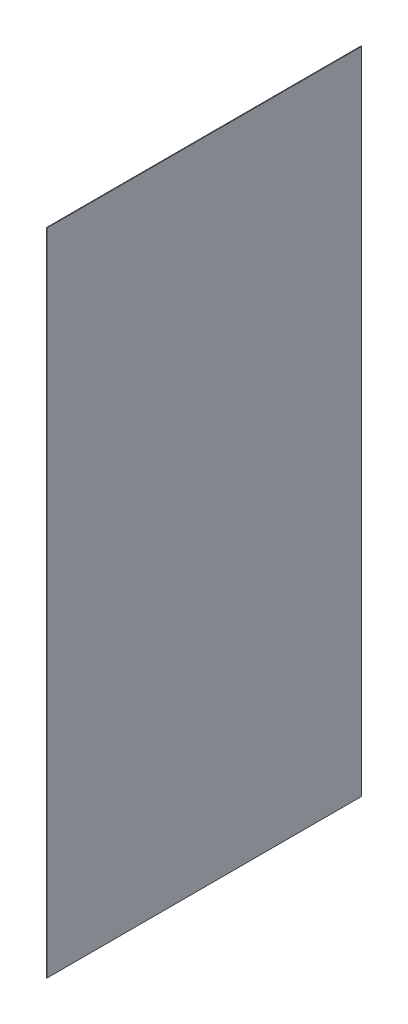
ISO-10303-21;
HEADER;
FILE_DESCRIPTION(('STEP AP214'),'2;1');
FILE_NAME('part.step','',(''),(''),'','','');
FILE_SCHEMA(('AUTOMOTIVE_DESIGN { 1 0 10303 214 1 1 1 1 }'));
ENDSEC;
DATA;
#1=APPLICATION_CONTEXT('core data for automotive mechanical design processes');
#2=APPLICATION_PROTOCOL_DEFINITION('international standard','automotive_design',2000,#1);
#3=PRODUCT_CONTEXT('',#1,'mechanical');
#4=PRODUCT('Part','Part','',(#3));
#5=PRODUCT_RELATED_PRODUCT_CATEGORY('part','',(#4));
#6=PRODUCT_DEFINITION_FORMATION('','',#4);
#7=PRODUCT_DEFINITION_CONTEXT('part definition',#1,'design');
#8=PRODUCT_DEFINITION('design','',#6,#7);
#9=PRODUCT_DEFINITION_SHAPE('','',#8);
#10=(LENGTH_UNIT() NAMED_UNIT(*) SI_UNIT(.MILLI.,.METRE.));
#11=(NAMED_UNIT(*) PLANE_ANGLE_UNIT() SI_UNIT($,.RADIAN.));
#12=(NAMED_UNIT(*) SI_UNIT($,.STERADIAN.) SOLID_ANGLE_UNIT());
#13=UNCERTAINTY_MEASURE_WITH_UNIT(LENGTH_MEASURE(1.E-05),#10,'distance_accuracy_value','');
#14=(GEOMETRIC_REPRESENTATION_CONTEXT(3) GLOBAL_UNCERTAINTY_ASSIGNED_CONTEXT((#13)) GLOBAL_UNIT_ASSIGNED_CONTEXT((#10,
#11,#12)) REPRESENTATION_CONTEXT('',''));
#15=CARTESIAN_POINT('',(0.,0.,0.));
#16=DIRECTION('',(0.,0.,1.));
#17=DIRECTION('',(1.,0.,0.));
#18=AXIS2_PLACEMENT_3D('',#15,#16,#17);
#19=CARTESIAN_POINT('',(3.175,3504.13943968538,32.862137229068));
#20=DIRECTION('',(0.,0.,-1.));
#21=DIRECTION('',(0.,1.,0.));
#22=AXIS2_PLACEMENT_3D('',#19,#20,#21);
#23=PLANE('',#22);
#24=DIRECTION('',(0.,-1.,0.));
#25=VECTOR('',#24,1.);
#26=CARTESIAN_POINT('',(0.,3504.13943968538,32.862137229068));
#27=LINE('',#26,#25);
#28=CARTESIAN_POINT('',(0.,3504.13943968538,32.862137229068));
#29=VERTEX_POINT('',#28);
#30=CARTESIAN_POINT('',(0.,-51.8605603146222,32.8621372290675));
#31=VERTEX_POINT('',#30);
#32=EDGE_CURVE('E80',#29,#31,#27,.T.);
#33=ORIENTED_EDGE('',*,*,#32,.T.);
#34=DIRECTION('',(-1.,0.,0.));
#35=VECTOR('',#34,1.);
#36=CARTESIAN_POINT('',(3.175,-51.8605603146222,32.8621372290675));
#37=LINE('',#36,#35);
#38=CARTESIAN_POINT('',(3.175,-51.8605603146222,32.8621372290675));
#39=VERTEX_POINT('',#38);
#40=EDGE_CURVE('E11',#39,#31,#37,.T.);
#41=ORIENTED_EDGE('',*,*,#40,.F.);
#42=DIRECTION('',(0.,-1.,0.));
#43=VECTOR('',#42,1.);
#44=CARTESIAN_POINT('',(3.175,3504.13943968538,32.862137229068));
#45=LINE('',#44,#43);
#46=CARTESIAN_POINT('',(3.175,3504.13943968538,32.862137229068));
#47=VERTEX_POINT('',#46);
#48=EDGE_CURVE('E68',#47,#39,#45,.T.);
#49=ORIENTED_EDGE('',*,*,#48,.F.);
#50=DIRECTION('',(-1.,0.,0.));
#51=VECTOR('',#50,1.);
#52=CARTESIAN_POINT('',(3.175,3504.13943968538,32.862137229068));
#53=LINE('',#52,#51);
#54=EDGE_CURVE('E76',#47,#29,#53,.T.);
#55=ORIENTED_EDGE('',*,*,#54,.T.);
#56=EDGE_LOOP('',(#33,#41,#49,#55));
#57=FACE_BOUND('',#56,.T.);
#58=ADVANCED_FACE('F17',(#57),#23,.F.);
#59=CARTESIAN_POINT('',(3.175,-51.8605603146222,32.8621372290675));
#60=DIRECTION('',(0.,1.,0.));
#61=DIRECTION('',(0.,0.,1.));
#62=AXIS2_PLACEMENT_3D('',#59,#60,#61);
#63=PLANE('',#62);
#64=DIRECTION('',(0.,0.,-1.));
#65=VECTOR('',#64,1.);
#66=CARTESIAN_POINT('',(0.,-51.8605603146222,32.8621372290675));
#67=LINE('',#66,#65);
#68=CARTESIAN_POINT('',(0.,-51.8605603146222,-1687.98786277093));
#69=VERTEX_POINT('',#68);
#70=EDGE_CURVE('E72',#31,#69,#67,.T.);
#71=ORIENTED_EDGE('',*,*,#70,.T.);
#72=DIRECTION('',(-1.,0.,0.));
#73=VECTOR('',#72,1.);
#74=CARTESIAN_POINT('',(3.175,-51.8605603146222,-1687.98786277093));
#75=LINE('',#74,#73);
#76=CARTESIAN_POINT('',(3.175,-51.8605603146222,-1687.98786277093));
#77=VERTEX_POINT('',#76);
#78=EDGE_CURVE('E25',#77,#69,#75,.T.);
#79=ORIENTED_EDGE('',*,*,#78,.F.);
#80=DIRECTION('',(0.,0.,-1.));
#81=VECTOR('',#80,1.);
#82=CARTESIAN_POINT('',(3.175,-51.8605603146222,32.8621372290675));
#83=LINE('',#82,#81);
#84=EDGE_CURVE('E63',#39,#77,#83,.T.);
#85=ORIENTED_EDGE('',*,*,#84,.F.);
#86=ORIENTED_EDGE('',*,*,#40,.T.);
#87=EDGE_LOOP('',(#71,#79,#85,#86));
#88=FACE_BOUND('',#87,.T.);
#89=ADVANCED_FACE('F71',(#88),#63,.F.);
#90=CARTESIAN_POINT('',(3.175,3504.13943968538,-1687.98786277093));
#91=DIRECTION('',(0.,0.,1.));
#92=DIRECTION('',(0.,-1.,0.));
#93=AXIS2_PLACEMENT_3D('',#90,#91,#92);
#94=PLANE('',#93);
#95=DIRECTION('',(0.,1.,0.));
#96=VECTOR('',#95,1.);
#97=CARTESIAN_POINT('',(0.,3504.13943968538,-1687.98786277093));
#98=LINE('',#97,#96);
#99=CARTESIAN_POINT('',(0.,3504.13943968538,-1687.98786277093));
#100=VERTEX_POINT('',#99);
#101=EDGE_CURVE('E50',#69,#100,#98,.T.);
#102=ORIENTED_EDGE('',*,*,#101,.T.);
#103=DIRECTION('',(-1.,0.,0.));
#104=VECTOR('',#103,1.);
#105=CARTESIAN_POINT('',(3.175,3504.13943968538,-1687.98786277093));
#106=LINE('',#105,#104);
#107=CARTESIAN_POINT('',(3.175,3504.13943968538,-1687.98786277093));
#108=VERTEX_POINT('',#107);
#109=EDGE_CURVE('E73',#108,#100,#106,.T.);
#110=ORIENTED_EDGE('',*,*,#109,.F.);
#111=DIRECTION('',(0.,1.,0.));
#112=VECTOR('',#111,1.);
#113=CARTESIAN_POINT('',(3.175,3504.13943968538,-1687.98786277093));
#114=LINE('',#113,#112);
#115=EDGE_CURVE('E66',#77,#108,#114,.T.);
#116=ORIENTED_EDGE('',*,*,#115,.F.);
#117=ORIENTED_EDGE('',*,*,#78,.T.);
#118=EDGE_LOOP('',(#102,#110,#116,#117));
#119=FACE_BOUND('',#118,.T.);
#120=ADVANCED_FACE('F74',(#119),#94,.F.);
#121=CARTESIAN_POINT('',(3.175,3504.13943968538,32.862137229068));
#122=DIRECTION('',(0.,-1.,0.));
#123=DIRECTION('',(0.,0.,-1.));
#124=AXIS2_PLACEMENT_3D('',#121,#122,#123);
#125=PLANE('',#124);
#126=DIRECTION('',(0.,0.,1.));
#127=VECTOR('',#126,1.);
#128=CARTESIAN_POINT('',(0.,3504.13943968538,32.862137229068));
#129=LINE('',#128,#127);
#130=EDGE_CURVE('E56',#100,#29,#129,.T.);
#131=ORIENTED_EDGE('',*,*,#130,.T.);
#132=ORIENTED_EDGE('',*,*,#54,.F.);
#133=DIRECTION('',(0.,0.,1.));
#134=VECTOR('',#133,1.);
#135=CARTESIAN_POINT('',(3.175,3504.13943968538,32.862137229068));
#136=LINE('',#135,#134);
#137=EDGE_CURVE('E33',#108,#47,#136,.T.);
#138=ORIENTED_EDGE('',*,*,#137,.F.);
#139=ORIENTED_EDGE('',*,*,#109,.T.);
#140=EDGE_LOOP('',(#131,#132,#138,#139));
#141=FACE_BOUND('',#140,.T.);
#142=ADVANCED_FACE('F87',(#141),#125,.F.);
#143=CARTESIAN_POINT('',(3.175,-51.8605603146222,32.8621372290675));
#144=DIRECTION('',(1.,0.,0.));
#145=DIRECTION('',(0.,0.,-1.));
#146=AXIS2_PLACEMENT_3D('',#143,#144,#145);
#147=PLANE('',#146);
#148=ORIENTED_EDGE('',*,*,#48,.T.);
#149=ORIENTED_EDGE('',*,*,#84,.T.);
#150=ORIENTED_EDGE('',*,*,#115,.T.);
#151=ORIENTED_EDGE('',*,*,#137,.T.);
#152=EDGE_LOOP('',(#148,#149,#150,#151));
#153=FACE_BOUND('',#152,.T.);
#154=ADVANCED_FACE('F64',(#153),#147,.T.);
#155=CARTESIAN_POINT('',(0.,-51.8605603146222,32.8621372290675));
#156=DIRECTION('',(1.,0.,0.));
#157=DIRECTION('',(0.,0.,-1.));
#158=AXIS2_PLACEMENT_3D('',#155,#156,#157);
#159=PLANE('',#158);
#160=ORIENTED_EDGE('',*,*,#32,.F.);
#161=ORIENTED_EDGE('',*,*,#130,.F.);
#162=ORIENTED_EDGE('',*,*,#101,.F.);
#163=ORIENTED_EDGE('',*,*,#70,.F.);
#164=EDGE_LOOP('',(#160,#161,#162,#163));
#165=FACE_BOUND('',#164,.T.);
#166=ADVANCED_FACE('F90',(#165),#159,.F.);
#167=CLOSED_SHELL('',(#58,#89,#120,#142,#154,#166));
#168=MANIFOLD_SOLID_BREP('B1',#167);
#169=ADVANCED_BREP_SHAPE_REPRESENTATION('',(#18,#168),#14);
#170=SHAPE_DEFINITION_REPRESENTATION(#9,#169);
ENDSEC;
END-ISO-10303-21;
